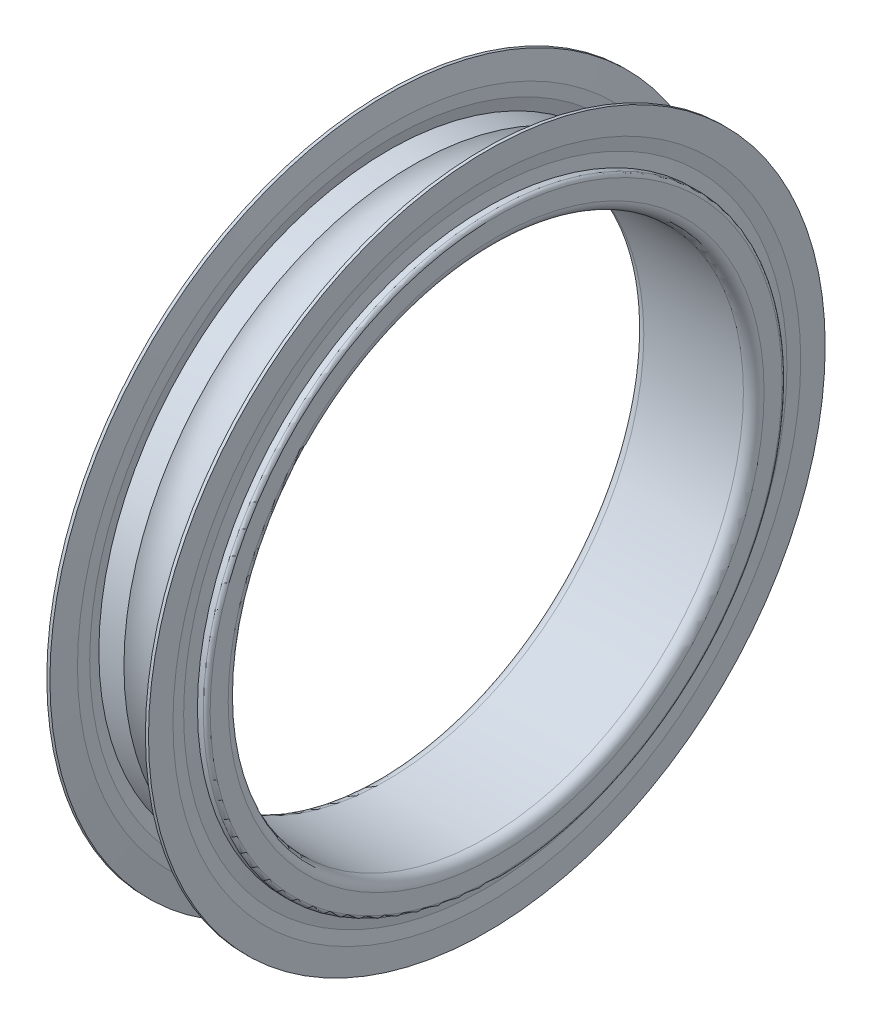
ISO-10303-21;
HEADER;
FILE_DESCRIPTION(('STEP AP214'),'2;1');
FILE_NAME('part.step','',(''),(''),'','','');
FILE_SCHEMA(('AUTOMOTIVE_DESIGN { 1 0 10303 214 1 1 1 1 }'));
ENDSEC;
DATA;
#1=APPLICATION_CONTEXT('core data for automotive mechanical design processes');
#2=APPLICATION_PROTOCOL_DEFINITION('international standard','automotive_design',2000,#1);
#3=PRODUCT_CONTEXT('',#1,'mechanical');
#4=PRODUCT('Part','Part','',(#3));
#5=PRODUCT_RELATED_PRODUCT_CATEGORY('part','',(#4));
#6=PRODUCT_DEFINITION_FORMATION('','',#4);
#7=PRODUCT_DEFINITION_CONTEXT('part definition',#1,'design');
#8=PRODUCT_DEFINITION('design','',#6,#7);
#9=PRODUCT_DEFINITION_SHAPE('','',#8);
#10=(LENGTH_UNIT() NAMED_UNIT(*) SI_UNIT(.MILLI.,.METRE.));
#11=(NAMED_UNIT(*) PLANE_ANGLE_UNIT() SI_UNIT($,.RADIAN.));
#12=(NAMED_UNIT(*) SI_UNIT($,.STERADIAN.) SOLID_ANGLE_UNIT());
#13=UNCERTAINTY_MEASURE_WITH_UNIT(LENGTH_MEASURE(1.E-05),#10,'distance_accuracy_value','');
#14=(GEOMETRIC_REPRESENTATION_CONTEXT(3) GLOBAL_UNCERTAINTY_ASSIGNED_CONTEXT((#13)) GLOBAL_UNIT_ASSIGNED_CONTEXT((#10,
#11,#12)) REPRESENTATION_CONTEXT('',''));
#15=CARTESIAN_POINT('',(0.,0.,0.));
#16=DIRECTION('',(0.,0.,1.));
#17=DIRECTION('',(1.,0.,0.));
#18=AXIS2_PLACEMENT_3D('',#15,#16,#17);
#19=CARTESIAN_POINT('',(0.,-16.9592961233174,-16.65));
#20=DIRECTION('',(-1.,0.,0.));
#21=DIRECTION('',(0.,0.,1.));
#22=AXIS2_PLACEMENT_3D('',#19,#20,#21);
#23=PLANE('',#22);
#24=CARTESIAN_POINT('',(0.,0.,0.));
#25=DIRECTION('',(-1.,0.,0.));
#26=DIRECTION('',(0.,0.,-1.));
#27=AXIS2_PLACEMENT_3D('',#24,#25,#26);
#28=CIRCLE('',#27,16.6499999999995);
#29=CARTESIAN_POINT('',(0.,0.,-16.6499999999995));
#30=VERTEX_POINT('',#29);
#31=EDGE_CURVE('E97',#30,#30,#28,.F.);
#32=ORIENTED_EDGE('',*,*,#31,.F.);
#33=EDGE_LOOP('',(#32));
#34=FACE_BOUND('',#33,.T.);
#35=CARTESIAN_POINT('',(0.,0.,0.));
#36=DIRECTION('',(1.,0.,0.));
#37=DIRECTION('',(0.,0.,1.));
#38=AXIS2_PLACEMENT_3D('',#35,#36,#37);
#39=CIRCLE('',#38,15.6);
#40=CARTESIAN_POINT('',(0.,0.,15.6));
#41=VERTEX_POINT('',#40);
#42=EDGE_CURVE('E94',#41,#41,#39,.T.);
#43=ORIENTED_EDGE('',*,*,#42,.T.);
#44=EDGE_LOOP('',(#43));
#45=FACE_BOUND('',#44,.T.);
#46=ADVANCED_FACE('F14',(#34,#45),#23,.T.);
#47=CARTESIAN_POINT('',(7.,-16.9592961233174,16.65));
#48=DIRECTION('',(1.,0.,0.));
#49=DIRECTION('',(0.,0.,-1.));
#50=AXIS2_PLACEMENT_3D('',#47,#48,#49);
#51=PLANE('',#50);
#52=CARTESIAN_POINT('',(7.,0.,0.));
#53=DIRECTION('',(1.,0.,0.));
#54=DIRECTION('',(0.,0.,1.));
#55=AXIS2_PLACEMENT_3D('',#52,#53,#54);
#56=CIRCLE('',#55,16.65);
#57=CARTESIAN_POINT('',(7.,0.,16.65));
#58=VERTEX_POINT('',#57);
#59=EDGE_CURVE('E91',#58,#58,#56,.T.);
#60=ORIENTED_EDGE('',*,*,#59,.T.);
#61=EDGE_LOOP('',(#60));
#62=FACE_BOUND('',#61,.T.);
#63=CARTESIAN_POINT('',(7.,0.,0.));
#64=DIRECTION('',(-1.,0.,0.));
#65=DIRECTION('',(0.,0.,-1.));
#66=AXIS2_PLACEMENT_3D('',#63,#64,#65);
#67=CIRCLE('',#66,15.600000079968);
#68=CARTESIAN_POINT('',(7.,0.,-15.600000079968));
#69=VERTEX_POINT('',#68);
#70=EDGE_CURVE('E88',#69,#69,#67,.F.);
#71=ORIENTED_EDGE('',*,*,#70,.F.);
#72=EDGE_LOOP('',(#71));
#73=FACE_BOUND('',#72,.T.);
#74=ADVANCED_FACE('F106',(#62,#73),#51,.T.);
#75=CARTESIAN_POINT('',(0.9,-18.6144826818994,18.275));
#76=DIRECTION('',(1.,0.,0.));
#77=DIRECTION('',(0.,0.,-1.));
#78=AXIS2_PLACEMENT_3D('',#75,#76,#77);
#79=PLANE('',#78);
#80=CARTESIAN_POINT('',(0.9,0.,0.));
#81=DIRECTION('',(1.,0.,0.));
#82=DIRECTION('',(0.,0.,1.));
#83=AXIS2_PLACEMENT_3D('',#80,#81,#82);
#84=CIRCLE('',#83,18.275);
#85=CARTESIAN_POINT('',(0.9,0.,18.275));
#86=VERTEX_POINT('',#85);
#87=EDGE_CURVE('E85',#86,#86,#84,.T.);
#88=ORIENTED_EDGE('',*,*,#87,.T.);
#89=EDGE_LOOP('',(#88));
#90=FACE_BOUND('',#89,.T.);
#91=CARTESIAN_POINT('',(0.9,0.,0.));
#92=DIRECTION('',(-1.,0.,0.));
#93=DIRECTION('',(0.,0.,-1.));
#94=AXIS2_PLACEMENT_3D('',#91,#92,#93);
#95=CIRCLE('',#94,17.5625);
#96=CARTESIAN_POINT('',(0.9,0.,-17.5625));
#97=VERTEX_POINT('',#96);
#98=EDGE_CURVE('E82',#97,#97,#95,.F.);
#99=ORIENTED_EDGE('',*,*,#98,.F.);
#100=EDGE_LOOP('',(#99));
#101=FACE_BOUND('',#100,.T.);
#102=ADVANCED_FACE('F215',(#90,#101),#79,.T.);
#103=CARTESIAN_POINT('',(0.54,-20.0659539717329,-19.7));
#104=DIRECTION('',(-1.,0.,0.));
#105=DIRECTION('',(0.,0.,1.));
#106=AXIS2_PLACEMENT_3D('',#103,#104,#105);
#107=PLANE('',#106);
#108=CARTESIAN_POINT('',(0.54,0.,0.));
#109=DIRECTION('',(-1.,0.,0.));
#110=DIRECTION('',(0.,0.,-1.));
#111=AXIS2_PLACEMENT_3D('',#108,#109,#110);
#112=CIRCLE('',#111,19.7);
#113=CARTESIAN_POINT('',(0.54,0.,-19.7));
#114=VERTEX_POINT('',#113);
#115=EDGE_CURVE('E79',#114,#114,#112,.F.);
#116=ORIENTED_EDGE('',*,*,#115,.F.);
#117=EDGE_LOOP('',(#116));
#118=FACE_BOUND('',#117,.T.);
#119=CARTESIAN_POINT('',(0.54,0.,0.));
#120=DIRECTION('',(1.,0.,0.));
#121=DIRECTION('',(0.,0.,1.));
#122=AXIS2_PLACEMENT_3D('',#119,#120,#121);
#123=CIRCLE('',#122,18.275);
#124=CARTESIAN_POINT('',(0.54,0.,18.275));
#125=VERTEX_POINT('',#124);
#126=EDGE_CURVE('E76',#125,#125,#123,.T.);
#127=ORIENTED_EDGE('',*,*,#126,.T.);
#128=EDGE_LOOP('',(#127));
#129=FACE_BOUND('',#128,.T.);
#130=ADVANCED_FACE('F198',(#118,#129),#107,.T.);
#131=CARTESIAN_POINT('',(6.1,-18.6144826711427,-18.275));
#132=DIRECTION('',(-1.,0.,0.));
#133=DIRECTION('',(0.,0.,1.));
#134=AXIS2_PLACEMENT_3D('',#131,#132,#133);
#135=PLANE('',#134);
#136=CARTESIAN_POINT('',(6.1,0.,0.));
#137=DIRECTION('',(-1.,0.,0.));
#138=DIRECTION('',(0.,0.,-1.));
#139=AXIS2_PLACEMENT_3D('',#136,#137,#138);
#140=CIRCLE('',#139,18.275);
#141=CARTESIAN_POINT('',(6.1,0.,-18.275));
#142=VERTEX_POINT('',#141);
#143=EDGE_CURVE('E73',#142,#142,#140,.F.);
#144=ORIENTED_EDGE('',*,*,#143,.F.);
#145=EDGE_LOOP('',(#144));
#146=FACE_BOUND('',#145,.T.);
#147=CARTESIAN_POINT('',(6.1,0.,0.));
#148=DIRECTION('',(1.,0.,0.));
#149=DIRECTION('',(0.,-1.16858902783796E-09,1.));
#150=AXIS2_PLACEMENT_3D('',#147,#148,#149);
#151=CIRCLE('',#150,17.5625);
#152=CARTESIAN_POINT('',(6.1,-2.05233448014042E-08,17.5625));
#153=VERTEX_POINT('',#152);
#154=EDGE_CURVE('E70',#153,#153,#151,.T.);
#155=ORIENTED_EDGE('',*,*,#154,.T.);
#156=EDGE_LOOP('',(#155));
#157=FACE_BOUND('',#156,.T.);
#158=ADVANCED_FACE('F189',(#146,#157),#135,.T.);
#159=CARTESIAN_POINT('',(6.46,-20.0659539374595,19.7));
#160=DIRECTION('',(1.,0.,0.));
#161=DIRECTION('',(0.,0.,-1.));
#162=AXIS2_PLACEMENT_3D('',#159,#160,#161);
#163=PLANE('',#162);
#164=CARTESIAN_POINT('',(6.46,0.,0.));
#165=DIRECTION('',(1.,0.,0.));
#166=DIRECTION('',(0.,-1.16848825032067E-09,1.));
#167=AXIS2_PLACEMENT_3D('',#164,#165,#166);
#168=CIRCLE('',#167,19.7);
#169=CARTESIAN_POINT('',(6.46,-2.30192185313172E-08,19.7));
#170=VERTEX_POINT('',#169);
#171=EDGE_CURVE('E67',#170,#170,#168,.T.);
#172=ORIENTED_EDGE('',*,*,#171,.T.);
#173=EDGE_LOOP('',(#172));
#174=FACE_BOUND('',#173,.T.);
#175=CARTESIAN_POINT('',(6.46,0.,0.));
#176=DIRECTION('',(-1.,0.,0.));
#177=DIRECTION('',(0.,0.,-1.));
#178=AXIS2_PLACEMENT_3D('',#175,#176,#177);
#179=CIRCLE('',#178,18.275);
#180=CARTESIAN_POINT('',(6.46,0.,-18.275));
#181=VERTEX_POINT('',#180);
#182=EDGE_CURVE('E64',#181,#181,#179,.F.);
#183=ORIENTED_EDGE('',*,*,#182,.F.);
#184=EDGE_LOOP('',(#183));
#185=FACE_BOUND('',#184,.T.);
#186=ADVANCED_FACE('F186',(#174,#185),#163,.T.);
#187=CARTESIAN_POINT('',(50.,0.,0.));
#188=DIRECTION('',(1.,0.,0.));
#189=DIRECTION('',(0.,1.92332494715483E-10,1.));
#190=AXIS2_PLACEMENT_3D('',#187,#188,#189);
#191=CYLINDRICAL_SURFACE('',#190,16.85);
#192=CARTESIAN_POINT('',(4.8190905958273,0.,0.));
#193=DIRECTION('',(1.,0.,0.));
#194=DIRECTION('',(0.,0.,1.));
#195=AXIS2_PLACEMENT_3D('',#192,#193,#194);
#196=CIRCLE('',#195,16.85);
#197=CARTESIAN_POINT('',(4.8190905958273,0.,16.85));
#198=VERTEX_POINT('',#197);
#199=EDGE_CURVE('E61',#198,#198,#196,.T.);
#200=ORIENTED_EDGE('',*,*,#199,.T.);
#201=EDGE_LOOP('',(#200));
#202=FACE_BOUND('',#201,.T.);
#203=CARTESIAN_POINT('',(6.28,0.,0.));
#204=DIRECTION('',(-1.,0.,0.));
#205=DIRECTION('',(0.,0.,-1.));
#206=AXIS2_PLACEMENT_3D('',#203,#204,#205);
#207=CIRCLE('',#206,16.85);
#208=CARTESIAN_POINT('',(6.28,0.,-16.85));
#209=VERTEX_POINT('',#208);
#210=EDGE_CURVE('E58',#209,#209,#207,.F.);
#211=ORIENTED_EDGE('',*,*,#210,.F.);
#212=EDGE_LOOP('',(#211));
#213=FACE_BOUND('',#212,.T.);
#214=ADVANCED_FACE('F188',(#202,#213),#191,.T.);
#215=CARTESIAN_POINT('',(50.,0.,0.));
#216=DIRECTION('',(1.,0.,0.));
#217=DIRECTION('',(0.,0.,1.));
#218=AXIS2_PLACEMENT_3D('',#215,#216,#217);
#219=CYLINDRICAL_SURFACE('',#218,16.85);
#220=CARTESIAN_POINT('',(0.200000000000003,0.,0.));
#221=DIRECTION('',(1.,0.,0.));
#222=DIRECTION('',(0.,0.,1.));
#223=AXIS2_PLACEMENT_3D('',#220,#221,#222);
#224=CIRCLE('',#223,16.85);
#225=CARTESIAN_POINT('',(0.200000000000003,0.,16.85));
#226=VERTEX_POINT('',#225);
#227=EDGE_CURVE('E55',#226,#226,#224,.T.);
#228=ORIENTED_EDGE('',*,*,#227,.T.);
#229=EDGE_LOOP('',(#228));
#230=FACE_BOUND('',#229,.T.);
#231=CARTESIAN_POINT('',(0.539999999999999,0.,0.));
#232=DIRECTION('',(-1.,0.,0.));
#233=DIRECTION('',(0.,0.,-1.));
#234=AXIS2_PLACEMENT_3D('',#231,#232,#233);
#235=CIRCLE('',#234,16.85);
#236=CARTESIAN_POINT('',(0.539999999999999,0.,-16.85));
#237=VERTEX_POINT('',#236);
#238=EDGE_CURVE('E52',#237,#237,#235,.F.);
#239=ORIENTED_EDGE('',*,*,#238,.F.);
#240=EDGE_LOOP('',(#239));
#241=FACE_BOUND('',#240,.T.);
#242=ADVANCED_FACE('F123',(#230,#241),#219,.T.);
#243=CARTESIAN_POINT('',(0.200000000000533,0.,0.));
#244=DIRECTION('',(1.,0.,0.));
#245=DIRECTION('',(0.,0.,1.));
#246=AXIS2_PLACEMENT_3D('',#243,#244,#245);
#247=TOROIDAL_SURFACE('',#246,16.6499999999995,0.200000000000533);
#248=ORIENTED_EDGE('',*,*,#31,.T.);
#249=EDGE_LOOP('',(#248));
#250=FACE_BOUND('',#249,.T.);
#251=ORIENTED_EDGE('',*,*,#227,.F.);
#252=EDGE_LOOP('',(#251));
#253=FACE_BOUND('',#252,.T.);
#254=ADVANCED_FACE('F101',(#250,#253),#247,.T.);
#255=CARTESIAN_POINT('',(0.599999999999875,0.,0.));
#256=DIRECTION('',(1.,0.,0.));
#257=DIRECTION('',(0.,0.,1.));
#258=AXIS2_PLACEMENT_3D('',#255,#256,#257);
#259=TOROIDAL_SURFACE('',#258,15.6,0.599999999999875);
#260=CARTESIAN_POINT('',(0.6,0.,0.));
#261=DIRECTION('',(1.,0.,0.));
#262=DIRECTION('',(0.,0.,1.));
#263=AXIS2_PLACEMENT_3D('',#260,#261,#262);
#264=CIRCLE('',#263,15.0000000000001);
#265=CARTESIAN_POINT('',(0.6,0.,15.0000000000001));
#266=VERTEX_POINT('',#265);
#267=EDGE_CURVE('E49',#266,#266,#264,.T.);
#268=ORIENTED_EDGE('',*,*,#267,.T.);
#269=EDGE_LOOP('',(#268));
#270=FACE_BOUND('',#269,.T.);
#271=ORIENTED_EDGE('',*,*,#42,.F.);
#272=EDGE_LOOP('',(#271));
#273=FACE_BOUND('',#272,.T.);
#274=ADVANCED_FACE('F110',(#270,#273),#259,.T.);
#275=CARTESIAN_POINT('',(50.,0.,0.));
#276=DIRECTION('',(1.,0.,0.));
#277=DIRECTION('',(0.,0.,1.));
#278=AXIS2_PLACEMENT_3D('',#275,#276,#277);
#279=CYLINDRICAL_SURFACE('',#278,15.);
#280=CARTESIAN_POINT('',(6.4,0.,0.));
#281=DIRECTION('',(1.,0.,0.));
#282=DIRECTION('',(0.,-1.9234201974874E-10,1.));
#283=AXIS2_PLACEMENT_3D('',#280,#281,#282);
#284=CIRCLE('',#283,15.);
#285=CARTESIAN_POINT('',(6.4,-2.8851302962311E-09,15.));
#286=VERTEX_POINT('',#285);
#287=EDGE_CURVE('E46',#286,#286,#284,.T.);
#288=ORIENTED_EDGE('',*,*,#287,.T.);
#289=EDGE_LOOP('',(#288));
#290=FACE_BOUND('',#289,.T.);
#291=ORIENTED_EDGE('',*,*,#267,.F.);
#292=EDGE_LOOP('',(#291));
#293=FACE_BOUND('',#292,.T.);
#294=ADVANCED_FACE('F112',(#290,#293),#279,.F.);
#295=CARTESIAN_POINT('',(6.40000000000008,0.,0.));
#296=DIRECTION('',(1.,0.,0.));
#297=DIRECTION('',(0.,0.,1.));
#298=AXIS2_PLACEMENT_3D('',#295,#296,#297);
#299=TOROIDAL_SURFACE('',#298,15.6,0.599999999999925);
#300=ORIENTED_EDGE('',*,*,#70,.T.);
#301=EDGE_LOOP('',(#300));
#302=FACE_BOUND('',#301,.T.);
#303=ORIENTED_EDGE('',*,*,#287,.F.);
#304=EDGE_LOOP('',(#303));
#305=FACE_BOUND('',#304,.T.);
#306=ADVANCED_FACE('F120',(#302,#305),#299,.T.);
#307=CARTESIAN_POINT('',(6.79999999999945,0.,0.));
#308=DIRECTION('',(1.,0.,0.));
#309=DIRECTION('',(0.,0.,1.));
#310=AXIS2_PLACEMENT_3D('',#307,#308,#309);
#311=TOROIDAL_SURFACE('',#310,16.6499999999995,0.200000000000548);
#312=CARTESIAN_POINT('',(6.79999999999945,0.,0.));
#313=DIRECTION('',(1.,0.,0.));
#314=DIRECTION('',(0.,0.,1.));
#315=AXIS2_PLACEMENT_3D('',#312,#313,#314);
#316=CIRCLE('',#315,16.85);
#317=CARTESIAN_POINT('',(6.79999999999945,0.,16.85));
#318=VERTEX_POINT('',#317);
#319=EDGE_CURVE('E43',#318,#318,#316,.T.);
#320=ORIENTED_EDGE('',*,*,#319,.T.);
#321=EDGE_LOOP('',(#320));
#322=FACE_BOUND('',#321,.T.);
#323=ORIENTED_EDGE('',*,*,#59,.F.);
#324=EDGE_LOOP('',(#323));
#325=FACE_BOUND('',#324,.T.);
#326=ADVANCED_FACE('F129',(#322,#325),#311,.T.);
#327=CARTESIAN_POINT('',(50.,0.,0.));
#328=DIRECTION('',(1.,0.,0.));
#329=DIRECTION('',(0.,0.,1.));
#330=AXIS2_PLACEMENT_3D('',#327,#328,#329);
#331=CYLINDRICAL_SURFACE('',#330,16.85);
#332=CARTESIAN_POINT('',(6.46,0.,0.));
#333=DIRECTION('',(1.,0.,0.));
#334=DIRECTION('',(0.,0.,1.));
#335=AXIS2_PLACEMENT_3D('',#332,#333,#334);
#336=CIRCLE('',#335,16.85);
#337=CARTESIAN_POINT('',(6.46,0.,16.85));
#338=VERTEX_POINT('',#337);
#339=EDGE_CURVE('E40',#338,#338,#336,.T.);
#340=ORIENTED_EDGE('',*,*,#339,.T.);
#341=EDGE_LOOP('',(#340));
#342=FACE_BOUND('',#341,.T.);
#343=ORIENTED_EDGE('',*,*,#319,.F.);
#344=EDGE_LOOP('',(#343));
#345=FACE_BOUND('',#344,.T.);
#346=ADVANCED_FACE('F133',(#342,#345),#331,.T.);
#347=CARTESIAN_POINT('',(3.5,0.,0.));
#348=DIRECTION('',(1.,0.,0.));
#349=DIRECTION('',(0.,0.,1.));
#350=AXIS2_PLACEMENT_3D('',#347,#348,#349);
#351=TOROIDAL_SURFACE('',#350,18.,1.75);
#352=ORIENTED_EDGE('',*,*,#199,.F.);
#353=EDGE_LOOP('',(#352));
#354=FACE_BOUND('',#353,.T.);
#355=CARTESIAN_POINT('',(2.1809094041727,0.,0.));
#356=DIRECTION('',(1.,0.,0.));
#357=DIRECTION('',(0.,0.,1.));
#358=AXIS2_PLACEMENT_3D('',#355,#356,#357);
#359=CIRCLE('',#358,16.85);
#360=CARTESIAN_POINT('',(2.1809094041727,0.,16.85));
#361=VERTEX_POINT('',#360);
#362=EDGE_CURVE('E37',#361,#361,#359,.T.);
#363=ORIENTED_EDGE('',*,*,#362,.T.);
#364=EDGE_LOOP('',(#363));
#365=FACE_BOUND('',#364,.T.);
#366=ADVANCED_FACE('F137',(#354,#365),#351,.F.);
#367=CARTESIAN_POINT('',(50.,0.,0.));
#368=DIRECTION('',(1.,0.,0.));
#369=DIRECTION('',(0.,0.,1.));
#370=AXIS2_PLACEMENT_3D('',#367,#368,#369);
#371=CYLINDRICAL_SURFACE('',#370,16.85);
#372=CARTESIAN_POINT('',(0.719999999999999,0.,0.));
#373=DIRECTION('',(1.,0.,0.));
#374=DIRECTION('',(0.,0.,1.));
#375=AXIS2_PLACEMENT_3D('',#372,#373,#374);
#376=CIRCLE('',#375,16.85);
#377=CARTESIAN_POINT('',(0.719999999999999,0.,16.85));
#378=VERTEX_POINT('',#377);
#379=EDGE_CURVE('E34',#378,#378,#376,.T.);
#380=ORIENTED_EDGE('',*,*,#379,.T.);
#381=EDGE_LOOP('',(#380));
#382=FACE_BOUND('',#381,.T.);
#383=ORIENTED_EDGE('',*,*,#362,.F.);
#384=EDGE_LOOP('',(#383));
#385=FACE_BOUND('',#384,.T.);
#386=ADVANCED_FACE('F141',(#382,#385),#371,.T.);
#387=CARTESIAN_POINT('',(0.630000000000001,0.,0.));
#388=DIRECTION('',(1.,0.,0.));
#389=DIRECTION('',(0.,0.,1.));
#390=AXIS2_PLACEMENT_3D('',#387,#388,#389);
#391=CONICAL_SURFACE('',#390,17.5625,1.44514599618505);
#392=ORIENTED_EDGE('',*,*,#238,.T.);
#393=EDGE_LOOP('',(#392));
#394=FACE_BOUND('',#393,.T.);
#395=CARTESIAN_POINT('',(0.630000000000001,0.,0.));
#396=DIRECTION('',(-1.,0.,0.));
#397=DIRECTION('',(0.,0.,-1.));
#398=AXIS2_PLACEMENT_3D('',#395,#396,#397);
#399=CIRCLE('',#398,17.5625);
#400=CARTESIAN_POINT('',(0.630000000000001,0.,-17.5625));
#401=VERTEX_POINT('',#400);
#402=EDGE_CURVE('E29',#401,#401,#399,.F.);
#403=ORIENTED_EDGE('',*,*,#402,.F.);
#404=EDGE_LOOP('',(#403));
#405=FACE_BOUND('',#404,.T.);
#406=ADVANCED_FACE('F145',(#394,#405),#391,.T.);
#407=CARTESIAN_POINT('',(0.9,0.,0.));
#408=DIRECTION('',(1.,0.,0.));
#409=DIRECTION('',(0.,0.,1.));
#410=AXIS2_PLACEMENT_3D('',#407,#408,#409);
#411=CONICAL_SURFACE('',#410,17.5625,1.32334242119842);
#412=ORIENTED_EDGE('',*,*,#98,.T.);
#413=EDGE_LOOP('',(#412));
#414=FACE_BOUND('',#413,.T.);
#415=ORIENTED_EDGE('',*,*,#379,.F.);
#416=EDGE_LOOP('',(#415));
#417=FACE_BOUND('',#416,.T.);
#418=ADVANCED_FACE('F149',(#414,#417),#411,.F.);
#419=CARTESIAN_POINT('',(0.719999999999998,0.,0.));
#420=DIRECTION('',(-1.,0.,0.));
#421=DIRECTION('',(0.,0.,-1.));
#422=AXIS2_PLACEMENT_3D('',#419,#420,#421);
#423=CONICAL_SURFACE('',#422,19.7,1.44514599618505);
#424=ORIENTED_EDGE('',*,*,#87,.F.);
#425=EDGE_LOOP('',(#424));
#426=FACE_BOUND('',#425,.T.);
#427=CARTESIAN_POINT('',(0.719999999999999,0.,0.));
#428=DIRECTION('',(1.,0.,0.));
#429=DIRECTION('',(0.,0.,1.));
#430=AXIS2_PLACEMENT_3D('',#427,#428,#429);
#431=CIRCLE('',#430,19.7);
#432=CARTESIAN_POINT('',(0.719999999999999,0.,19.7));
#433=VERTEX_POINT('',#432);
#434=EDGE_CURVE('E25',#433,#433,#431,.T.);
#435=ORIENTED_EDGE('',*,*,#434,.T.);
#436=EDGE_LOOP('',(#435));
#437=FACE_BOUND('',#436,.T.);
#438=ADVANCED_FACE('F153',(#426,#437),#423,.T.);
#439=CARTESIAN_POINT('',(2.,0.,0.));
#440=DIRECTION('',(1.,0.,0.));
#441=DIRECTION('',(0.,0.,1.));
#442=AXIS2_PLACEMENT_3D('',#439,#440,#441);
#443=CYLINDRICAL_SURFACE('',#442,19.7);
#444=ORIENTED_EDGE('',*,*,#115,.T.);
#445=EDGE_LOOP('',(#444));
#446=FACE_BOUND('',#445,.T.);
#447=ORIENTED_EDGE('',*,*,#434,.F.);
#448=EDGE_LOOP('',(#447));
#449=FACE_BOUND('',#448,.T.);
#450=ADVANCED_FACE('F157',(#446,#449),#443,.T.);
#451=CARTESIAN_POINT('',(0.54,0.,0.));
#452=DIRECTION('',(-1.,0.,0.));
#453=DIRECTION('',(0.,0.,-1.));
#454=AXIS2_PLACEMENT_3D('',#451,#452,#453);
#455=CONICAL_SURFACE('',#454,18.275,1.44514599618505);
#456=ORIENTED_EDGE('',*,*,#402,.T.);
#457=EDGE_LOOP('',(#456));
#458=FACE_BOUND('',#457,.T.);
#459=ORIENTED_EDGE('',*,*,#126,.F.);
#460=EDGE_LOOP('',(#459));
#461=FACE_BOUND('',#460,.T.);
#462=ADVANCED_FACE('F161',(#458,#461),#455,.F.);
#463=CARTESIAN_POINT('',(6.28,0.,0.));
#464=DIRECTION('',(1.,0.,0.));
#465=DIRECTION('',(0.,1.16855293253601E-09,1.));
#466=AXIS2_PLACEMENT_3D('',#463,#464,#465);
#467=CONICAL_SURFACE('',#466,19.7,1.44514599618505);
#468=ORIENTED_EDGE('',*,*,#143,.T.);
#469=EDGE_LOOP('',(#468));
#470=FACE_BOUND('',#469,.T.);
#471=CARTESIAN_POINT('',(6.28,0.,0.));
#472=DIRECTION('',(-1.,0.,0.));
#473=DIRECTION('',(0.,0.,-1.));
#474=AXIS2_PLACEMENT_3D('',#471,#472,#473);
#475=CIRCLE('',#474,19.7);
#476=CARTESIAN_POINT('',(6.28,0.,-19.7));
#477=VERTEX_POINT('',#476);
#478=EDGE_CURVE('E21',#477,#477,#475,.F.);
#479=ORIENTED_EDGE('',*,*,#478,.F.);
#480=EDGE_LOOP('',(#479));
#481=FACE_BOUND('',#480,.T.);
#482=ADVANCED_FACE('F165',(#470,#481),#467,.T.);
#483=CARTESIAN_POINT('',(6.1,0.,0.));
#484=DIRECTION('',(-1.,0.,0.));
#485=DIRECTION('',(0.,0.,-1.));
#486=AXIS2_PLACEMENT_3D('',#483,#484,#485);
#487=CONICAL_SURFACE('',#486,17.5625,1.32334242119842);
#488=ORIENTED_EDGE('',*,*,#210,.T.);
#489=EDGE_LOOP('',(#488));
#490=FACE_BOUND('',#489,.T.);
#491=ORIENTED_EDGE('',*,*,#154,.F.);
#492=EDGE_LOOP('',(#491));
#493=FACE_BOUND('',#492,.T.);
#494=ADVANCED_FACE('F169',(#490,#493),#487,.F.);
#495=CARTESIAN_POINT('',(6.37,0.,0.));
#496=DIRECTION('',(-1.,0.,0.));
#497=DIRECTION('',(0.,0.,-1.));
#498=AXIS2_PLACEMENT_3D('',#495,#496,#497);
#499=CONICAL_SURFACE('',#498,17.5625,1.44514599618505);
#500=ORIENTED_EDGE('',*,*,#339,.F.);
#501=EDGE_LOOP('',(#500));
#502=FACE_BOUND('',#501,.T.);
#503=CARTESIAN_POINT('',(6.37,0.,0.));
#504=DIRECTION('',(1.,0.,0.));
#505=DIRECTION('',(0.,0.,1.));
#506=AXIS2_PLACEMENT_3D('',#503,#504,#505);
#507=CIRCLE('',#506,17.5625);
#508=CARTESIAN_POINT('',(6.37,0.,17.5625));
#509=VERTEX_POINT('',#508);
#510=EDGE_CURVE('E10',#509,#509,#507,.T.);
#511=ORIENTED_EDGE('',*,*,#510,.T.);
#512=EDGE_LOOP('',(#511));
#513=FACE_BOUND('',#512,.T.);
#514=ADVANCED_FACE('F173',(#502,#513),#499,.T.);
#515=CARTESIAN_POINT('',(6.46,0.,0.));
#516=DIRECTION('',(1.,0.,0.));
#517=DIRECTION('',(0.,1.16855293253601E-09,1.));
#518=AXIS2_PLACEMENT_3D('',#515,#516,#517);
#519=CONICAL_SURFACE('',#518,18.275,1.44514599618505);
#520=ORIENTED_EDGE('',*,*,#182,.T.);
#521=EDGE_LOOP('',(#520));
#522=FACE_BOUND('',#521,.T.);
#523=ORIENTED_EDGE('',*,*,#510,.F.);
#524=EDGE_LOOP('',(#523));
#525=FACE_BOUND('',#524,.T.);
#526=ADVANCED_FACE('F176',(#522,#525),#519,.F.);
#527=CARTESIAN_POINT('',(2.,0.,0.));
#528=DIRECTION('',(1.,0.,0.));
#529=DIRECTION('',(0.,7.69358033177322E-10,1.));
#530=AXIS2_PLACEMENT_3D('',#527,#528,#529);
#531=CYLINDRICAL_SURFACE('',#530,19.7);
#532=ORIENTED_EDGE('',*,*,#478,.T.);
#533=EDGE_LOOP('',(#532));
#534=FACE_BOUND('',#533,.T.);
#535=ORIENTED_EDGE('',*,*,#171,.F.);
#536=EDGE_LOOP('',(#535));
#537=FACE_BOUND('',#536,.T.);
#538=ADVANCED_FACE('F16',(#534,#537),#531,.T.);
#539=CLOSED_SHELL('',(#46,#74,#102,#130,#158,#186,#214,#242,#254,#274,#294,#306,#326,#346,#366,
#386,#406,#418,#438,#450,#462,#482,#494,#514,#526,#538));
#540=MANIFOLD_SOLID_BREP('B1',#539);
#541=ADVANCED_BREP_SHAPE_REPRESENTATION('',(#18,#540),#14);
#542=SHAPE_DEFINITION_REPRESENTATION(#9,#541);
ENDSEC;
END-ISO-10303-21;
